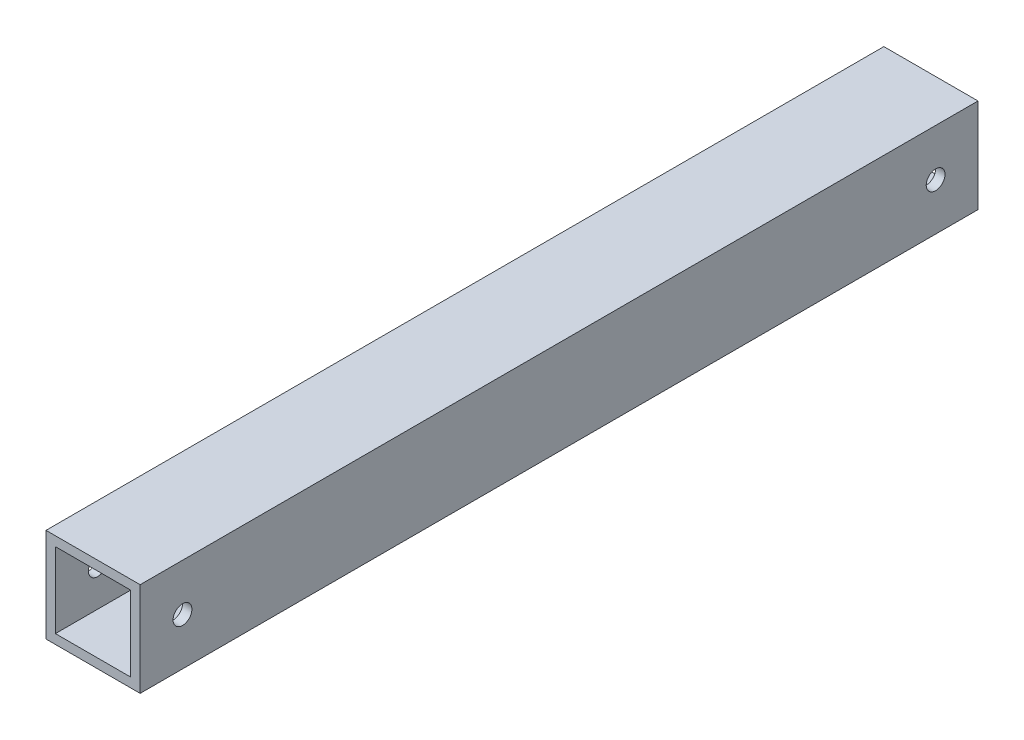
ISO-10303-21;
HEADER;
FILE_DESCRIPTION(('STEP AP214'),'2;1');
FILE_NAME('part.step','',(''),(''),'','','');
FILE_SCHEMA(('AUTOMOTIVE_DESIGN { 1 0 10303 214 1 1 1 1 }'));
ENDSEC;
DATA;
#1=APPLICATION_CONTEXT('core data for automotive mechanical design processes');
#2=APPLICATION_PROTOCOL_DEFINITION('international standard','automotive_design',2000,#1);
#3=PRODUCT_CONTEXT('',#1,'mechanical');
#4=PRODUCT('Part','Part','',(#3));
#5=PRODUCT_RELATED_PRODUCT_CATEGORY('part','',(#4));
#6=PRODUCT_DEFINITION_FORMATION('','',#4);
#7=PRODUCT_DEFINITION_CONTEXT('part definition',#1,'design');
#8=PRODUCT_DEFINITION('design','',#6,#7);
#9=PRODUCT_DEFINITION_SHAPE('','',#8);
#10=(LENGTH_UNIT() NAMED_UNIT(*) SI_UNIT(.MILLI.,.METRE.));
#11=(NAMED_UNIT(*) PLANE_ANGLE_UNIT() SI_UNIT($,.RADIAN.));
#12=(NAMED_UNIT(*) SI_UNIT($,.STERADIAN.) SOLID_ANGLE_UNIT());
#13=UNCERTAINTY_MEASURE_WITH_UNIT(LENGTH_MEASURE(1.E-05),#10,'distance_accuracy_value','');
#14=(GEOMETRIC_REPRESENTATION_CONTEXT(3) GLOBAL_UNCERTAINTY_ASSIGNED_CONTEXT((#13)) GLOBAL_UNIT_ASSIGNED_CONTEXT((#10,
#11,#12)) REPRESENTATION_CONTEXT('',''));
#15=CARTESIAN_POINT('',(0.,0.,0.));
#16=DIRECTION('',(0.,0.,1.));
#17=DIRECTION('',(1.,0.,0.));
#18=AXIS2_PLACEMENT_3D('',#15,#16,#17);
#19=CARTESIAN_POINT('',(10.,10.,90.));
#20=DIRECTION('',(-1.,0.,0.));
#21=DIRECTION('',(0.,-1.,0.));
#22=AXIS2_PLACEMENT_3D('',#19,#20,#21);
#23=PLANE('',#22);
#24=CARTESIAN_POINT('',(10.,0.,-80.));
#25=DIRECTION('',(1.,0.,0.));
#26=DIRECTION('',(0.,1.,0.));
#27=AXIS2_PLACEMENT_3D('',#24,#25,#26);
#28=CIRCLE('',#27,2.);
#29=CARTESIAN_POINT('',(10.,2.,-80.));
#30=VERTEX_POINT('',#29);
#31=EDGE_CURVE('E219',#30,#30,#28,.T.);
#32=ORIENTED_EDGE('',*,*,#31,.F.);
#33=EDGE_LOOP('',(#32));
#34=FACE_BOUND('',#33,.T.);
#35=CARTESIAN_POINT('',(10.,0.,80.));
#36=DIRECTION('',(1.,0.,0.));
#37=DIRECTION('',(0.,1.,0.));
#38=AXIS2_PLACEMENT_3D('',#35,#36,#37);
#39=CIRCLE('',#38,2.);
#40=CARTESIAN_POINT('',(10.,2.,80.));
#41=VERTEX_POINT('',#40);
#42=EDGE_CURVE('E223',#41,#41,#39,.T.);
#43=ORIENTED_EDGE('',*,*,#42,.F.);
#44=EDGE_LOOP('',(#43));
#45=FACE_BOUND('',#44,.T.);
#46=DIRECTION('',(0.,0.,-1.));
#47=VECTOR('',#46,1.);
#48=CARTESIAN_POINT('',(10.,10.,90.));
#49=LINE('',#48,#47);
#50=CARTESIAN_POINT('',(10.,10.,89.));
#51=VERTEX_POINT('',#50);
#52=CARTESIAN_POINT('',(10.,10.,-89.));
#53=VERTEX_POINT('',#52);
#54=EDGE_CURVE('E132',#51,#53,#49,.T.);
#55=ORIENTED_EDGE('',*,*,#54,.F.);
#56=DIRECTION('',(0.,1.,0.));
#57=VECTOR('',#56,1.);
#58=CARTESIAN_POINT('',(10.,10.,89.));
#59=LINE('',#58,#57);
#60=CARTESIAN_POINT('',(10.,-10.,89.));
#61=VERTEX_POINT('',#60);
#62=EDGE_CURVE('E110',#61,#51,#59,.T.);
#63=ORIENTED_EDGE('',*,*,#62,.F.);
#64=DIRECTION('',(0.,0.,-1.));
#65=VECTOR('',#64,1.);
#66=CARTESIAN_POINT('',(10.,-10.,90.));
#67=LINE('',#66,#65);
#68=CARTESIAN_POINT('',(10.,-10.,-88.9999999999999));
#69=VERTEX_POINT('',#68);
#70=EDGE_CURVE('E137',#61,#69,#67,.T.);
#71=ORIENTED_EDGE('',*,*,#70,.T.);
#72=DIRECTION('',(0.,-1.,0.));
#73=VECTOR('',#72,1.);
#74=CARTESIAN_POINT('',(10.,10.,-89.));
#75=LINE('',#74,#73);
#76=EDGE_CURVE('E68',#53,#69,#75,.T.);
#77=ORIENTED_EDGE('',*,*,#76,.F.);
#78=EDGE_LOOP('',(#55,#63,#71,#77));
#79=FACE_BOUND('',#78,.T.);
#80=ADVANCED_FACE('F45',(#34,#45,#79),#23,.F.);
#81=CARTESIAN_POINT('',(-10.,10.,90.));
#82=DIRECTION('',(0.,-1.,0.));
#83=DIRECTION('',(1.,0.,0.));
#84=AXIS2_PLACEMENT_3D('',#81,#82,#83);
#85=PLANE('',#84);
#86=DIRECTION('',(0.,0.,-1.));
#87=VECTOR('',#86,1.);
#88=CARTESIAN_POINT('',(-10.,10.,90.));
#89=LINE('',#88,#87);
#90=CARTESIAN_POINT('',(-10.,10.,89.));
#91=VERTEX_POINT('',#90);
#92=CARTESIAN_POINT('',(-10.,10.,-89.));
#93=VERTEX_POINT('',#92);
#94=EDGE_CURVE('E123',#91,#93,#89,.T.);
#95=ORIENTED_EDGE('',*,*,#94,.F.);
#96=DIRECTION('',(1.,0.,0.));
#97=VECTOR('',#96,1.);
#98=CARTESIAN_POINT('',(-10.,10.,89.));
#99=LINE('',#98,#97);
#100=EDGE_CURVE('E107',#91,#51,#99,.T.);
#101=ORIENTED_EDGE('',*,*,#100,.T.);
#102=ORIENTED_EDGE('',*,*,#54,.T.);
#103=DIRECTION('',(1.,0.,0.));
#104=VECTOR('',#103,1.);
#105=CARTESIAN_POINT('',(-10.,10.,-89.));
#106=LINE('',#105,#104);
#107=EDGE_CURVE('E130',#93,#53,#106,.T.);
#108=ORIENTED_EDGE('',*,*,#107,.F.);
#109=EDGE_LOOP('',(#95,#101,#102,#108));
#110=FACE_BOUND('',#109,.T.);
#111=ADVANCED_FACE('F129',(#110),#85,.F.);
#112=CARTESIAN_POINT('',(-10.,10.,90.));
#113=DIRECTION('',(1.,0.,0.));
#114=DIRECTION('',(0.,1.,0.));
#115=AXIS2_PLACEMENT_3D('',#112,#113,#114);
#116=PLANE('',#115);
#117=CARTESIAN_POINT('',(-10.,0.,-80.));
#118=DIRECTION('',(1.,0.,0.));
#119=DIRECTION('',(0.,1.,0.));
#120=AXIS2_PLACEMENT_3D('',#117,#118,#119);
#121=CIRCLE('',#120,2.);
#122=CARTESIAN_POINT('',(-10.,2.,-80.));
#123=VERTEX_POINT('',#122);
#124=EDGE_CURVE('E146',#123,#123,#121,.T.);
#125=ORIENTED_EDGE('',*,*,#124,.T.);
#126=EDGE_LOOP('',(#125));
#127=FACE_BOUND('',#126,.T.);
#128=CARTESIAN_POINT('',(-10.,0.,80.));
#129=DIRECTION('',(1.,0.,0.));
#130=DIRECTION('',(0.,1.,0.));
#131=AXIS2_PLACEMENT_3D('',#128,#129,#130);
#132=CIRCLE('',#131,2.);
#133=CARTESIAN_POINT('',(-10.,2.,80.));
#134=VERTEX_POINT('',#133);
#135=EDGE_CURVE('E215',#134,#134,#132,.T.);
#136=ORIENTED_EDGE('',*,*,#135,.T.);
#137=EDGE_LOOP('',(#136));
#138=FACE_BOUND('',#137,.T.);
#139=DIRECTION('',(0.,0.,-1.));
#140=VECTOR('',#139,1.);
#141=CARTESIAN_POINT('',(-10.,-10.,90.));
#142=LINE('',#141,#140);
#143=CARTESIAN_POINT('',(-10.,-10.,89.));
#144=VERTEX_POINT('',#143);
#145=CARTESIAN_POINT('',(-10.,-10.,-89.));
#146=VERTEX_POINT('',#145);
#147=EDGE_CURVE('E125',#144,#146,#142,.T.);
#148=ORIENTED_EDGE('',*,*,#147,.F.);
#149=DIRECTION('',(0.,1.,0.));
#150=VECTOR('',#149,1.);
#151=CARTESIAN_POINT('',(-10.,10.,89.));
#152=LINE('',#151,#150);
#153=EDGE_CURVE('E60',#144,#91,#152,.T.);
#154=ORIENTED_EDGE('',*,*,#153,.T.);
#155=ORIENTED_EDGE('',*,*,#94,.T.);
#156=DIRECTION('',(0.,-1.,0.));
#157=VECTOR('',#156,1.);
#158=CARTESIAN_POINT('',(-10.,10.,-89.));
#159=LINE('',#158,#157);
#160=EDGE_CURVE('E364',#93,#146,#159,.T.);
#161=ORIENTED_EDGE('',*,*,#160,.T.);
#162=EDGE_LOOP('',(#148,#154,#155,#161));
#163=FACE_BOUND('',#162,.T.);
#164=ADVANCED_FACE('F121',(#127,#138,#163),#116,.F.);
#165=CARTESIAN_POINT('',(-10.,-10.,90.));
#166=DIRECTION('',(0.,1.,0.));
#167=DIRECTION('',(-1.,0.,0.));
#168=AXIS2_PLACEMENT_3D('',#165,#166,#167);
#169=PLANE('',#168);
#170=ORIENTED_EDGE('',*,*,#70,.F.);
#171=DIRECTION('',(-1.,0.,0.));
#172=VECTOR('',#171,1.);
#173=CARTESIAN_POINT('',(-10.,-10.,89.));
#174=LINE('',#173,#172);
#175=EDGE_CURVE('E199',#61,#144,#174,.T.);
#176=ORIENTED_EDGE('',*,*,#175,.T.);
#177=ORIENTED_EDGE('',*,*,#147,.T.);
#178=DIRECTION('',(1.,0.,0.));
#179=VECTOR('',#178,1.);
#180=CARTESIAN_POINT('',(-10.,-10.,-89.));
#181=LINE('',#180,#179);
#182=EDGE_CURVE('E173',#146,#69,#181,.T.);
#183=ORIENTED_EDGE('',*,*,#182,.T.);
#184=EDGE_LOOP('',(#170,#176,#177,#183));
#185=FACE_BOUND('',#184,.T.);
#186=ADVANCED_FACE('F198',(#185),#169,.F.);
#187=CARTESIAN_POINT('',(8.,8.,90.));
#188=DIRECTION('',(-1.,0.,0.));
#189=DIRECTION('',(0.,0.,1.));
#190=AXIS2_PLACEMENT_3D('',#187,#188,#189);
#191=PLANE('',#190);
#192=DIRECTION('',(0.,-1.,0.));
#193=VECTOR('',#192,1.);
#194=CARTESIAN_POINT('',(8.,8.,89.));
#195=LINE('',#194,#193);
#196=CARTESIAN_POINT('',(8.,8.,89.));
#197=VERTEX_POINT('',#196);
#198=CARTESIAN_POINT('',(8.,-8.,89.));
#199=VERTEX_POINT('',#198);
#200=EDGE_CURVE('E210',#197,#199,#195,.T.);
#201=ORIENTED_EDGE('',*,*,#200,.F.);
#202=DIRECTION('',(0.,0.,-1.));
#203=VECTOR('',#202,1.);
#204=CARTESIAN_POINT('',(8.,8.,90.));
#205=LINE('',#204,#203);
#206=CARTESIAN_POINT('',(8.,8.,-89.));
#207=VERTEX_POINT('',#206);
#208=EDGE_CURVE('E171',#197,#207,#205,.T.);
#209=ORIENTED_EDGE('',*,*,#208,.T.);
#210=DIRECTION('',(0.,1.,0.));
#211=VECTOR('',#210,1.);
#212=CARTESIAN_POINT('',(8.,8.,-89.));
#213=LINE('',#212,#211);
#214=CARTESIAN_POINT('',(8.,-8.,-89.));
#215=VERTEX_POINT('',#214);
#216=EDGE_CURVE('E156',#215,#207,#213,.T.);
#217=ORIENTED_EDGE('',*,*,#216,.F.);
#218=DIRECTION('',(0.,0.,-1.));
#219=VECTOR('',#218,1.);
#220=CARTESIAN_POINT('',(8.,-8.,90.));
#221=LINE('',#220,#219);
#222=EDGE_CURVE('E169',#199,#215,#221,.T.);
#223=ORIENTED_EDGE('',*,*,#222,.F.);
#224=EDGE_LOOP('',(#201,#209,#217,#223));
#225=FACE_BOUND('',#224,.T.);
#226=CARTESIAN_POINT('',(8.,0.,-80.));
#227=DIRECTION('',(-1.,0.,0.));
#228=DIRECTION('',(0.,0.,1.));
#229=AXIS2_PLACEMENT_3D('',#226,#227,#228);
#230=CIRCLE('',#229,2.);
#231=CARTESIAN_POINT('',(8.,0.,-78.));
#232=VERTEX_POINT('',#231);
#233=EDGE_CURVE('E150',#232,#232,#230,.T.);
#234=ORIENTED_EDGE('',*,*,#233,.F.);
#235=EDGE_LOOP('',(#234));
#236=FACE_BOUND('',#235,.T.);
#237=CARTESIAN_POINT('',(8.,0.,80.));
#238=DIRECTION('',(-1.,0.,0.));
#239=DIRECTION('',(0.,0.,1.));
#240=AXIS2_PLACEMENT_3D('',#237,#238,#239);
#241=CIRCLE('',#240,2.);
#242=CARTESIAN_POINT('',(8.,0.,82.));
#243=VERTEX_POINT('',#242);
#244=EDGE_CURVE('E145',#243,#243,#241,.T.);
#245=ORIENTED_EDGE('',*,*,#244,.F.);
#246=EDGE_LOOP('',(#245));
#247=FACE_BOUND('',#246,.T.);
#248=ADVANCED_FACE('F167',(#225,#236,#247),#191,.T.);
#249=CARTESIAN_POINT('',(-8.,8.,90.));
#250=DIRECTION('',(0.,-1.,0.));
#251=DIRECTION('',(0.,0.,-1.));
#252=AXIS2_PLACEMENT_3D('',#249,#250,#251);
#253=PLANE('',#252);
#254=DIRECTION('',(1.,0.,0.));
#255=VECTOR('',#254,1.);
#256=CARTESIAN_POINT('',(-8.,8.,89.));
#257=LINE('',#256,#255);
#258=CARTESIAN_POINT('',(-8.,8.,89.));
#259=VERTEX_POINT('',#258);
#260=EDGE_CURVE('E204',#259,#197,#257,.T.);
#261=ORIENTED_EDGE('',*,*,#260,.F.);
#262=DIRECTION('',(0.,0.,-1.));
#263=VECTOR('',#262,1.);
#264=CARTESIAN_POINT('',(-8.,8.,90.));
#265=LINE('',#264,#263);
#266=CARTESIAN_POINT('',(-8.,8.,-89.));
#267=VERTEX_POINT('',#266);
#268=EDGE_CURVE('E183',#259,#267,#265,.T.);
#269=ORIENTED_EDGE('',*,*,#268,.T.);
#270=DIRECTION('',(-1.,0.,0.));
#271=VECTOR('',#270,1.);
#272=CARTESIAN_POINT('',(-8.,8.,-89.));
#273=LINE('',#272,#271);
#274=EDGE_CURVE('E174',#207,#267,#273,.T.);
#275=ORIENTED_EDGE('',*,*,#274,.F.);
#276=ORIENTED_EDGE('',*,*,#208,.F.);
#277=EDGE_LOOP('',(#261,#269,#275,#276));
#278=FACE_BOUND('',#277,.T.);
#279=ADVANCED_FACE('F237',(#278),#253,.T.);
#280=CARTESIAN_POINT('',(-8.,8.,90.));
#281=DIRECTION('',(1.,0.,0.));
#282=DIRECTION('',(0.,1.,0.));
#283=AXIS2_PLACEMENT_3D('',#280,#281,#282);
#284=PLANE('',#283);
#285=DIRECTION('',(0.,1.,0.));
#286=VECTOR('',#285,1.);
#287=CARTESIAN_POINT('',(-8.,8.,89.));
#288=LINE('',#287,#286);
#289=CARTESIAN_POINT('',(-8.,-8.,89.));
#290=VERTEX_POINT('',#289);
#291=EDGE_CURVE('E201',#290,#259,#288,.T.);
#292=ORIENTED_EDGE('',*,*,#291,.F.);
#293=DIRECTION('',(0.,0.,-1.));
#294=VECTOR('',#293,1.);
#295=CARTESIAN_POINT('',(-8.,-8.,90.));
#296=LINE('',#295,#294);
#297=CARTESIAN_POINT('',(-8.,-8.,-88.9999999999999));
#298=VERTEX_POINT('',#297);
#299=EDGE_CURVE('E179',#290,#298,#296,.T.);
#300=ORIENTED_EDGE('',*,*,#299,.T.);
#301=DIRECTION('',(0.,-1.,0.));
#302=VECTOR('',#301,1.);
#303=CARTESIAN_POINT('',(-8.,8.,-89.));
#304=LINE('',#303,#302);
#305=EDGE_CURVE('E116',#267,#298,#304,.T.);
#306=ORIENTED_EDGE('',*,*,#305,.F.);
#307=ORIENTED_EDGE('',*,*,#268,.F.);
#308=EDGE_LOOP('',(#292,#300,#306,#307));
#309=FACE_BOUND('',#308,.T.);
#310=CARTESIAN_POINT('',(-8.,0.,-80.));
#311=DIRECTION('',(1.,0.,0.));
#312=DIRECTION('',(0.,1.,0.));
#313=AXIS2_PLACEMENT_3D('',#310,#311,#312);
#314=CIRCLE('',#313,2.);
#315=CARTESIAN_POINT('',(-8.,2.,-80.));
#316=VERTEX_POINT('',#315);
#317=EDGE_CURVE('E147',#316,#316,#314,.T.);
#318=ORIENTED_EDGE('',*,*,#317,.F.);
#319=EDGE_LOOP('',(#318));
#320=FACE_BOUND('',#319,.T.);
#321=CARTESIAN_POINT('',(-8.,0.,80.));
#322=DIRECTION('',(1.,0.,0.));
#323=DIRECTION('',(0.,1.,0.));
#324=AXIS2_PLACEMENT_3D('',#321,#322,#323);
#325=CIRCLE('',#324,2.);
#326=CARTESIAN_POINT('',(-8.,2.,80.));
#327=VERTEX_POINT('',#326);
#328=EDGE_CURVE('E141',#327,#327,#325,.T.);
#329=ORIENTED_EDGE('',*,*,#328,.F.);
#330=EDGE_LOOP('',(#329));
#331=FACE_BOUND('',#330,.T.);
#332=ADVANCED_FACE('F243',(#309,#320,#331),#284,.T.);
#333=CARTESIAN_POINT('',(-8.,-8.,90.));
#334=DIRECTION('',(0.,1.,0.));
#335=DIRECTION('',(-1.,0.,0.));
#336=AXIS2_PLACEMENT_3D('',#333,#334,#335);
#337=PLANE('',#336);
#338=DIRECTION('',(-1.,0.,0.));
#339=VECTOR('',#338,1.);
#340=CARTESIAN_POINT('',(-8.,-8.,89.));
#341=LINE('',#340,#339);
#342=EDGE_CURVE('E11',#199,#290,#341,.T.);
#343=ORIENTED_EDGE('',*,*,#342,.F.);
#344=ORIENTED_EDGE('',*,*,#222,.T.);
#345=DIRECTION('',(1.,0.,0.));
#346=VECTOR('',#345,1.);
#347=CARTESIAN_POINT('',(-8.,-8.,-89.));
#348=LINE('',#347,#346);
#349=EDGE_CURVE('E53',#298,#215,#348,.T.);
#350=ORIENTED_EDGE('',*,*,#349,.F.);
#351=ORIENTED_EDGE('',*,*,#299,.F.);
#352=EDGE_LOOP('',(#343,#344,#350,#351));
#353=FACE_BOUND('',#352,.T.);
#354=ADVANCED_FACE('F177',(#353),#337,.T.);
#355=CARTESIAN_POINT('',(-10.,0.,80.));
#356=DIRECTION('',(1.,0.,0.));
#357=DIRECTION('',(0.,1.,0.));
#358=AXIS2_PLACEMENT_3D('',#355,#356,#357);
#359=CYLINDRICAL_SURFACE('',#358,2.);
#360=ORIENTED_EDGE('',*,*,#328,.T.);
#361=EDGE_LOOP('',(#360));
#362=FACE_BOUND('',#361,.T.);
#363=ORIENTED_EDGE('',*,*,#135,.F.);
#364=EDGE_LOOP('',(#363));
#365=FACE_BOUND('',#364,.T.);
#366=ADVANCED_FACE('F260',(#362,#365),#359,.F.);
#367=CARTESIAN_POINT('',(-10.,0.,-80.));
#368=DIRECTION('',(1.,0.,0.));
#369=DIRECTION('',(0.,1.,0.));
#370=AXIS2_PLACEMENT_3D('',#367,#368,#369);
#371=CYLINDRICAL_SURFACE('',#370,2.);
#372=ORIENTED_EDGE('',*,*,#317,.T.);
#373=EDGE_LOOP('',(#372));
#374=FACE_BOUND('',#373,.T.);
#375=ORIENTED_EDGE('',*,*,#124,.F.);
#376=EDGE_LOOP('',(#375));
#377=FACE_BOUND('',#376,.T.);
#378=ADVANCED_FACE('F258',(#374,#377),#371,.F.);
#379=ORIENTED_EDGE('',*,*,#244,.T.);
#380=EDGE_LOOP('',(#379));
#381=FACE_BOUND('',#380,.T.);
#382=ORIENTED_EDGE('',*,*,#42,.T.);
#383=EDGE_LOOP('',(#382));
#384=FACE_BOUND('',#383,.T.);
#385=ADVANCED_FACE('F233',(#381,#384),#359,.F.);
#386=ORIENTED_EDGE('',*,*,#233,.T.);
#387=EDGE_LOOP('',(#386));
#388=FACE_BOUND('',#387,.T.);
#389=ORIENTED_EDGE('',*,*,#31,.T.);
#390=EDGE_LOOP('',(#389));
#391=FACE_BOUND('',#390,.T.);
#392=ADVANCED_FACE('F257',(#388,#391),#371,.F.);
#393=CARTESIAN_POINT('',(-10.,10.,-89.));
#394=DIRECTION('',(0.,0.,1.));
#395=DIRECTION('',(1.,0.,0.));
#396=AXIS2_PLACEMENT_3D('',#393,#394,#395);
#397=PLANE('',#396);
#398=ORIENTED_EDGE('',*,*,#216,.T.);
#399=ORIENTED_EDGE('',*,*,#274,.T.);
#400=ORIENTED_EDGE('',*,*,#305,.T.);
#401=ORIENTED_EDGE('',*,*,#349,.T.);
#402=EDGE_LOOP('',(#398,#399,#400,#401));
#403=FACE_BOUND('',#402,.T.);
#404=ORIENTED_EDGE('',*,*,#160,.F.);
#405=ORIENTED_EDGE('',*,*,#107,.T.);
#406=ORIENTED_EDGE('',*,*,#76,.T.);
#407=ORIENTED_EDGE('',*,*,#182,.F.);
#408=EDGE_LOOP('',(#404,#405,#406,#407));
#409=FACE_BOUND('',#408,.T.);
#410=ADVANCED_FACE('F155',(#403,#409),#397,.F.);
#411=CARTESIAN_POINT('',(-10.,10.,89.));
#412=DIRECTION('',(0.,0.,-1.));
#413=DIRECTION('',(-1.,0.,0.));
#414=AXIS2_PLACEMENT_3D('',#411,#412,#413);
#415=PLANE('',#414);
#416=ORIENTED_EDGE('',*,*,#200,.T.);
#417=ORIENTED_EDGE('',*,*,#342,.T.);
#418=ORIENTED_EDGE('',*,*,#291,.T.);
#419=ORIENTED_EDGE('',*,*,#260,.T.);
#420=EDGE_LOOP('',(#416,#417,#418,#419));
#421=FACE_BOUND('',#420,.T.);
#422=ORIENTED_EDGE('',*,*,#62,.T.);
#423=ORIENTED_EDGE('',*,*,#100,.F.);
#424=ORIENTED_EDGE('',*,*,#153,.F.);
#425=ORIENTED_EDGE('',*,*,#175,.F.);
#426=EDGE_LOOP('',(#422,#423,#424,#425));
#427=FACE_BOUND('',#426,.T.);
#428=ADVANCED_FACE('F108',(#421,#427),#415,.F.);
#429=CLOSED_SHELL('',(#80,#111,#164,#186,#248,#279,#332,#354,#366,#378,#385,#392,#410,#428));
#430=MANIFOLD_SOLID_BREP('B2',#429);
#431=ADVANCED_BREP_SHAPE_REPRESENTATION('',(#18,#430),#14);
#432=SHAPE_DEFINITION_REPRESENTATION(#9,#431);
ENDSEC;
END-ISO-10303-21;
